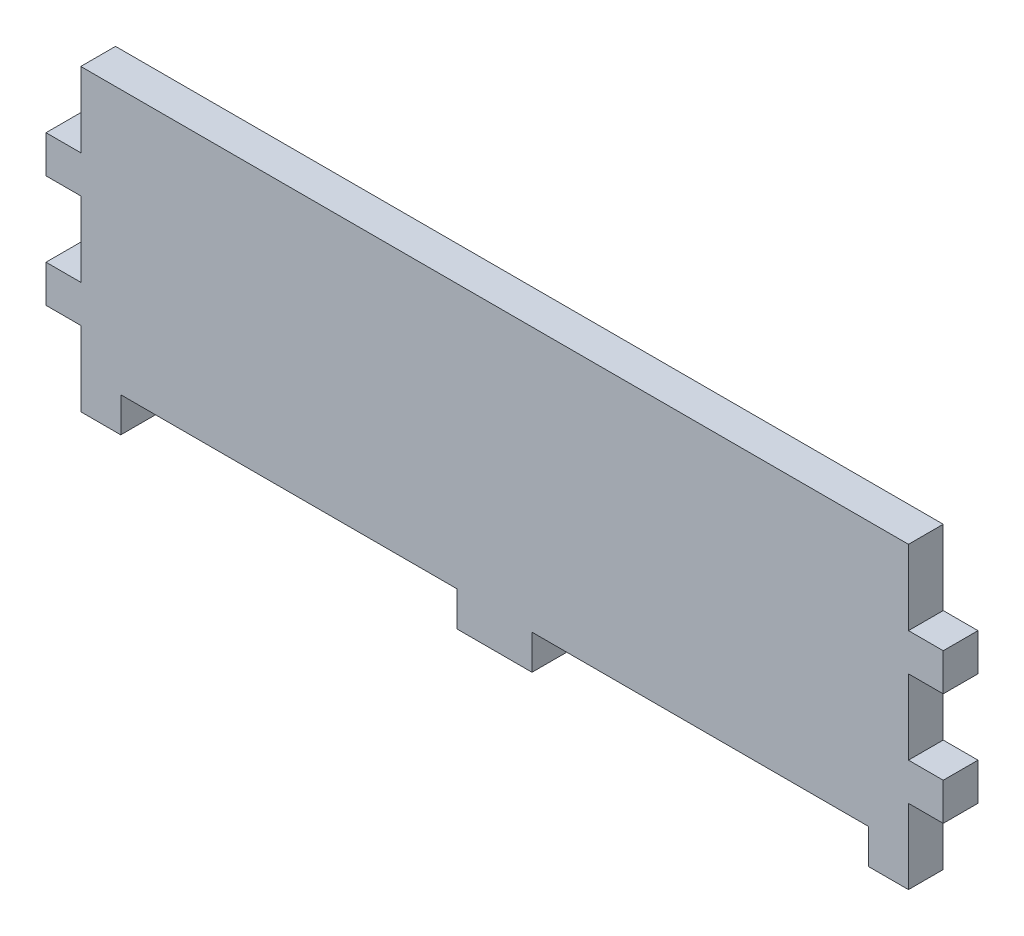
ISO-10303-21;
HEADER;
FILE_DESCRIPTION(('STEP AP214'),'2;1');
FILE_NAME('part.step','',(''),(''),'','','');
FILE_SCHEMA(('AUTOMOTIVE_DESIGN { 1 0 10303 214 1 1 1 1 }'));
ENDSEC;
DATA;
#1=APPLICATION_CONTEXT('core data for automotive mechanical design processes');
#2=APPLICATION_PROTOCOL_DEFINITION('international standard','automotive_design',2000,#1);
#3=PRODUCT_CONTEXT('',#1,'mechanical');
#4=PRODUCT('Part','Part','',(#3));
#5=PRODUCT_RELATED_PRODUCT_CATEGORY('part','',(#4));
#6=PRODUCT_DEFINITION_FORMATION('','',#4);
#7=PRODUCT_DEFINITION_CONTEXT('part definition',#1,'design');
#8=PRODUCT_DEFINITION('design','',#6,#7);
#9=PRODUCT_DEFINITION_SHAPE('','',#8);
#10=(LENGTH_UNIT() NAMED_UNIT(*) SI_UNIT(.MILLI.,.METRE.));
#11=(NAMED_UNIT(*) PLANE_ANGLE_UNIT() SI_UNIT($,.RADIAN.));
#12=(NAMED_UNIT(*) SI_UNIT($,.STERADIAN.) SOLID_ANGLE_UNIT());
#13=UNCERTAINTY_MEASURE_WITH_UNIT(LENGTH_MEASURE(1.E-05),#10,'distance_accuracy_value','');
#14=(GEOMETRIC_REPRESENTATION_CONTEXT(3) GLOBAL_UNCERTAINTY_ASSIGNED_CONTEXT((#13)) GLOBAL_UNIT_ASSIGNED_CONTEXT((#10,
#11,#12)) REPRESENTATION_CONTEXT('',''));
#15=CARTESIAN_POINT('',(0.,0.,0.));
#16=DIRECTION('',(0.,0.,1.));
#17=DIRECTION('',(1.,0.,0.));
#18=AXIS2_PLACEMENT_3D('',#15,#16,#17);
#19=CARTESIAN_POINT('',(-382.738681283592,-50.7278101317852,11.81));
#20=DIRECTION('',(-1.,0.,0.));
#21=DIRECTION('',(0.,-1.,0.));
#22=AXIS2_PLACEMENT_3D('',#19,#20,#21);
#23=PLANE('',#22);
#24=DIRECTION('',(0.,0.,1.));
#25=VECTOR('',#24,1.);
#26=CARTESIAN_POINT('',(-382.738681283592,-114.227810131785,0.));
#27=LINE('',#26,#25);
#28=CARTESIAN_POINT('',(-382.738681283592,-114.227810131785,0.));
#29=VERTEX_POINT('',#28);
#30=CARTESIAN_POINT('',(-382.738681283592,-114.227810131785,11.81));
#31=VERTEX_POINT('',#30);
#32=EDGE_CURVE('E410',#29,#31,#27,.T.);
#33=ORIENTED_EDGE('',*,*,#32,.T.);
#34=DIRECTION('',(0.,1.,0.));
#35=VECTOR('',#34,1.);
#36=CARTESIAN_POINT('',(-382.738681283592,-50.7278101317852,11.81));
#37=LINE('',#36,#35);
#38=CARTESIAN_POINT('',(-382.738681283592,-126.927810131785,11.81));
#39=VERTEX_POINT('',#38);
#40=EDGE_CURVE('E273',#39,#31,#37,.T.);
#41=ORIENTED_EDGE('',*,*,#40,.F.);
#42=DIRECTION('',(0.,0.,1.));
#43=VECTOR('',#42,1.);
#44=CARTESIAN_POINT('',(-382.738681283592,-126.927810131785,0.));
#45=LINE('',#44,#43);
#46=CARTESIAN_POINT('',(-382.738681283592,-126.927810131785,0.));
#47=VERTEX_POINT('',#46);
#48=EDGE_CURVE('E438',#47,#39,#45,.T.);
#49=ORIENTED_EDGE('',*,*,#48,.F.);
#50=DIRECTION('',(0.,1.,0.));
#51=VECTOR('',#50,1.);
#52=CARTESIAN_POINT('',(-382.738681283592,-50.7278101317852,0.));
#53=LINE('',#52,#51);
#54=EDGE_CURVE('E244',#47,#29,#53,.T.);
#55=ORIENTED_EDGE('',*,*,#54,.T.);
#56=EDGE_LOOP('',(#33,#41,#49,#55));
#57=FACE_BOUND('',#56,.T.);
#58=ADVANCED_FACE('F34',(#57),#23,.F.);
#59=DIRECTION('',(0.,0.,1.));
#60=VECTOR('',#59,1.);
#61=CARTESIAN_POINT('',(-382.738681283592,-88.8278101317852,0.));
#62=LINE('',#61,#60);
#63=CARTESIAN_POINT('',(-382.738681283592,-88.8278101317852,0.));
#64=VERTEX_POINT('',#63);
#65=CARTESIAN_POINT('',(-382.738681283592,-88.8278101317852,11.81));
#66=VERTEX_POINT('',#65);
#67=EDGE_CURVE('E222',#64,#66,#62,.T.);
#68=ORIENTED_EDGE('',*,*,#67,.F.);
#69=CARTESIAN_POINT('',(-382.738681283592,-76.1278101317852,0.));
#70=VERTEX_POINT('',#69);
#71=EDGE_CURVE('E235',#64,#70,#53,.T.);
#72=ORIENTED_EDGE('',*,*,#71,.T.);
#73=DIRECTION('',(0.,0.,1.));
#74=VECTOR('',#73,1.);
#75=CARTESIAN_POINT('',(-382.738681283592,-76.1278101317852,0.));
#76=LINE('',#75,#74);
#77=CARTESIAN_POINT('',(-382.738681283592,-76.1278101317852,11.81));
#78=VERTEX_POINT('',#77);
#79=EDGE_CURVE('E491',#70,#78,#76,.T.);
#80=ORIENTED_EDGE('',*,*,#79,.T.);
#81=EDGE_CURVE('E237',#66,#78,#37,.T.);
#82=ORIENTED_EDGE('',*,*,#81,.F.);
#83=EDGE_LOOP('',(#68,#72,#80,#82));
#84=FACE_BOUND('',#83,.T.);
#85=ADVANCED_FACE('F233',(#84),#23,.F.);
#86=CARTESIAN_POINT('',(0.,0.,11.81));
#87=DIRECTION('',(0.,0.,1.));
#88=DIRECTION('',(1.,0.,0.));
#89=AXIS2_PLACEMENT_3D('',#86,#87,#88);
#90=PLANE('',#89);
#91=ORIENTED_EDGE('',*,*,#40,.T.);
#92=DIRECTION('',(-1.,0.,0.));
#93=VECTOR('',#92,1.);
#94=CARTESIAN_POINT('',(-382.738681283592,-114.227810131785,11.81));
#95=LINE('',#94,#93);
#96=CARTESIAN_POINT('',(-394.548681283592,-114.227810131785,11.81));
#97=VERTEX_POINT('',#96);
#98=EDGE_CURVE('E228',#31,#97,#95,.T.);
#99=ORIENTED_EDGE('',*,*,#98,.T.);
#100=DIRECTION('',(0.,1.,0.));
#101=VECTOR('',#100,1.);
#102=CARTESIAN_POINT('',(-394.548681283592,-114.227810131785,11.81));
#103=LINE('',#102,#101);
#104=CARTESIAN_POINT('',(-394.548681283592,-88.8278101317852,11.81));
#105=VERTEX_POINT('',#104);
#106=EDGE_CURVE('E504',#97,#105,#103,.T.);
#107=ORIENTED_EDGE('',*,*,#106,.T.);
#108=DIRECTION('',(1.,0.,0.));
#109=VECTOR('',#108,1.);
#110=CARTESIAN_POINT('',(-382.738681283592,-88.8278101317852,11.81));
#111=LINE('',#110,#109);
#112=EDGE_CURVE('E493',#105,#66,#111,.T.);
#113=ORIENTED_EDGE('',*,*,#112,.T.);
#114=ORIENTED_EDGE('',*,*,#81,.T.);
#115=DIRECTION('',(-1.,0.,0.));
#116=VECTOR('',#115,1.);
#117=CARTESIAN_POINT('',(-382.738681283592,-76.1278101317852,11.81));
#118=LINE('',#117,#116);
#119=CARTESIAN_POINT('',(-394.548681283592,-76.1278101317852,11.81));
#120=VERTEX_POINT('',#119);
#121=EDGE_CURVE('E494',#78,#120,#118,.T.);
#122=ORIENTED_EDGE('',*,*,#121,.T.);
#123=DIRECTION('',(0.,1.,0.));
#124=VECTOR('',#123,1.);
#125=CARTESIAN_POINT('',(-394.548681283592,-76.1278101317852,11.81));
#126=LINE('',#125,#124);
#127=CARTESIAN_POINT('',(-394.548681283592,-50.7278101317852,11.81));
#128=VERTEX_POINT('',#127);
#129=EDGE_CURVE('E496',#120,#128,#126,.T.);
#130=ORIENTED_EDGE('',*,*,#129,.T.);
#131=DIRECTION('',(-1.,0.,0.));
#132=VECTOR('',#131,1.);
#133=CARTESIAN_POINT('',(-687.538681283592,-50.7278101317852,11.81));
#134=LINE('',#133,#132);
#135=CARTESIAN_POINT('',(-675.728681283592,-50.7278101317852,11.81));
#136=VERTEX_POINT('',#135);
#137=EDGE_CURVE('E278',#128,#136,#134,.T.);
#138=ORIENTED_EDGE('',*,*,#137,.T.);
#139=DIRECTION('',(0.,1.,0.));
#140=VECTOR('',#139,1.);
#141=CARTESIAN_POINT('',(-675.728681283592,-76.1278101317852,11.81));
#142=LINE('',#141,#140);
#143=CARTESIAN_POINT('',(-675.728681283592,-76.1278101317852,11.81));
#144=VERTEX_POINT('',#143);
#145=EDGE_CURVE('E467',#144,#136,#142,.T.);
#146=ORIENTED_EDGE('',*,*,#145,.F.);
#147=DIRECTION('',(1.,0.,0.));
#148=VECTOR('',#147,1.);
#149=CARTESIAN_POINT('',(-687.538681283592,-76.1278101317852,11.81));
#150=LINE('',#149,#148);
#151=CARTESIAN_POINT('',(-687.538681283592,-76.1278101317852,11.81));
#152=VERTEX_POINT('',#151);
#153=EDGE_CURVE('E435',#152,#144,#150,.T.);
#154=ORIENTED_EDGE('',*,*,#153,.F.);
#155=DIRECTION('',(0.,-1.,0.));
#156=VECTOR('',#155,1.);
#157=CARTESIAN_POINT('',(-687.538681283592,-50.7278101317852,11.81));
#158=LINE('',#157,#156);
#159=CARTESIAN_POINT('',(-687.538681283592,-88.8278101317852,11.81));
#160=VERTEX_POINT('',#159);
#161=EDGE_CURVE('E282',#152,#160,#158,.T.);
#162=ORIENTED_EDGE('',*,*,#161,.T.);
#163=DIRECTION('',(-1.,0.,0.));
#164=VECTOR('',#163,1.);
#165=CARTESIAN_POINT('',(-687.538681283592,-88.8278101317852,11.81));
#166=LINE('',#165,#164);
#167=CARTESIAN_POINT('',(-675.728681283592,-88.8278101317852,11.81));
#168=VERTEX_POINT('',#167);
#169=EDGE_CURVE('E444',#168,#160,#166,.T.);
#170=ORIENTED_EDGE('',*,*,#169,.F.);
#171=DIRECTION('',(0.,1.,0.));
#172=VECTOR('',#171,1.);
#173=CARTESIAN_POINT('',(-675.728681283592,-114.227810131785,11.81));
#174=LINE('',#173,#172);
#175=CARTESIAN_POINT('',(-675.728681283592,-114.227810131785,11.81));
#176=VERTEX_POINT('',#175);
#177=EDGE_CURVE('E454',#176,#168,#174,.T.);
#178=ORIENTED_EDGE('',*,*,#177,.F.);
#179=DIRECTION('',(1.,0.,0.));
#180=VECTOR('',#179,1.);
#181=CARTESIAN_POINT('',(-687.538681283592,-114.227810131785,11.81));
#182=LINE('',#181,#180);
#183=CARTESIAN_POINT('',(-687.538681283592,-114.227810131785,11.81));
#184=VERTEX_POINT('',#183);
#185=EDGE_CURVE('E451',#184,#176,#182,.T.);
#186=ORIENTED_EDGE('',*,*,#185,.F.);
#187=CARTESIAN_POINT('',(-687.538681283592,-126.927810131785,11.81));
#188=VERTEX_POINT('',#187);
#189=EDGE_CURVE('E281',#184,#188,#158,.T.);
#190=ORIENTED_EDGE('',*,*,#189,.T.);
#191=DIRECTION('',(-1.,0.,0.));
#192=VECTOR('',#191,1.);
#193=CARTESIAN_POINT('',(-687.538681283592,-126.927810131785,11.81));
#194=LINE('',#193,#192);
#195=CARTESIAN_POINT('',(-675.728681283592,-126.927810131785,11.81));
#196=VERTEX_POINT('',#195);
#197=EDGE_CURVE('E350',#196,#188,#194,.T.);
#198=ORIENTED_EDGE('',*,*,#197,.F.);
#199=DIRECTION('',(0.,1.,0.));
#200=VECTOR('',#199,1.);
#201=CARTESIAN_POINT('',(-675.728681283592,-152.327810131785,11.81));
#202=LINE('',#201,#200);
#203=CARTESIAN_POINT('',(-675.728681283592,-152.327810131785,11.81));
#204=VERTEX_POINT('',#203);
#205=EDGE_CURVE('E340',#204,#196,#202,.T.);
#206=ORIENTED_EDGE('',*,*,#205,.F.);
#207=DIRECTION('',(1.,0.,0.));
#208=VECTOR('',#207,1.);
#209=CARTESIAN_POINT('',(-687.538681283592,-152.327810131785,11.81));
#210=LINE('',#209,#208);
#211=CARTESIAN_POINT('',(-662.138681283592,-152.327810131785,11.81));
#212=VERTEX_POINT('',#211);
#213=EDGE_CURVE('E359',#204,#212,#210,.T.);
#214=ORIENTED_EDGE('',*,*,#213,.T.);
#215=DIRECTION('',(0.,1.,0.));
#216=VECTOR('',#215,1.);
#217=CARTESIAN_POINT('',(-662.138681283592,-152.327810131785,11.81));
#218=LINE('',#217,#216);
#219=CARTESIAN_POINT('',(-662.138681283592,-140.517810131785,11.81));
#220=VERTEX_POINT('',#219);
#221=EDGE_CURVE('E366',#212,#220,#218,.T.);
#222=ORIENTED_EDGE('',*,*,#221,.T.);
#223=DIRECTION('',(1.,0.,0.));
#224=VECTOR('',#223,1.);
#225=CARTESIAN_POINT('',(-687.538681283592,-140.517810131785,11.81));
#226=LINE('',#225,#224);
#227=CARTESIAN_POINT('',(-547.838681283592,-140.517810131785,11.81));
#228=VERTEX_POINT('',#227);
#229=EDGE_CURVE('E11',#220,#228,#226,.T.);
#230=ORIENTED_EDGE('',*,*,#229,.T.);
#231=DIRECTION('',(0.,-1.,0.));
#232=VECTOR('',#231,1.);
#233=CARTESIAN_POINT('',(-547.838681283592,-152.327810131785,11.81));
#234=LINE('',#233,#232);
#235=CARTESIAN_POINT('',(-547.838681283592,-152.327810131785,11.81));
#236=VERTEX_POINT('',#235);
#237=EDGE_CURVE('E321',#228,#236,#234,.T.);
#238=ORIENTED_EDGE('',*,*,#237,.T.);
#239=DIRECTION('',(1.,0.,0.));
#240=VECTOR('',#239,1.);
#241=CARTESIAN_POINT('',(-547.838681283592,-152.327810131785,11.81));
#242=LINE('',#241,#240);
#243=CARTESIAN_POINT('',(-522.438681283592,-152.327810131785,11.81));
#244=VERTEX_POINT('',#243);
#245=EDGE_CURVE('E335',#236,#244,#242,.T.);
#246=ORIENTED_EDGE('',*,*,#245,.T.);
#247=DIRECTION('',(0.,1.,0.));
#248=VECTOR('',#247,1.);
#249=CARTESIAN_POINT('',(-522.438681283592,-152.327810131785,11.81));
#250=LINE('',#249,#248);
#251=CARTESIAN_POINT('',(-522.438681283592,-140.517810131785,11.81));
#252=VERTEX_POINT('',#251);
#253=EDGE_CURVE('E300',#244,#252,#250,.T.);
#254=ORIENTED_EDGE('',*,*,#253,.T.);
#255=CARTESIAN_POINT('',(-408.138681283592,-140.517810131785,11.81));
#256=VERTEX_POINT('',#255);
#257=EDGE_CURVE('E42',#252,#256,#226,.T.);
#258=ORIENTED_EDGE('',*,*,#257,.T.);
#259=DIRECTION('',(0.,-1.,0.));
#260=VECTOR('',#259,1.);
#261=CARTESIAN_POINT('',(-408.138681283592,-152.327810131785,11.81));
#262=LINE('',#261,#260);
#263=CARTESIAN_POINT('',(-408.138681283592,-152.327810131785,11.81));
#264=VERTEX_POINT('',#263);
#265=EDGE_CURVE('E297',#256,#264,#262,.T.);
#266=ORIENTED_EDGE('',*,*,#265,.T.);
#267=DIRECTION('',(1.,0.,0.));
#268=VECTOR('',#267,1.);
#269=CARTESIAN_POINT('',(-408.138681283592,-152.327810131785,11.81));
#270=LINE('',#269,#268);
#271=CARTESIAN_POINT('',(-394.548681283592,-152.327810131785,11.81));
#272=VERTEX_POINT('',#271);
#273=EDGE_CURVE('E309',#264,#272,#270,.T.);
#274=ORIENTED_EDGE('',*,*,#273,.T.);
#275=DIRECTION('',(0.,1.,0.));
#276=VECTOR('',#275,1.);
#277=CARTESIAN_POINT('',(-394.548681283592,-152.327810131785,11.81));
#278=LINE('',#277,#276);
#279=CARTESIAN_POINT('',(-394.548681283592,-126.927810131785,11.81));
#280=VERTEX_POINT('',#279);
#281=EDGE_CURVE('E422',#272,#280,#278,.T.);
#282=ORIENTED_EDGE('',*,*,#281,.T.);
#283=DIRECTION('',(1.,0.,0.));
#284=VECTOR('',#283,1.);
#285=CARTESIAN_POINT('',(-382.738681283592,-126.927810131785,11.81));
#286=LINE('',#285,#284);
#287=EDGE_CURVE('E414',#280,#39,#286,.T.);
#288=ORIENTED_EDGE('',*,*,#287,.T.);
#289=EDGE_LOOP('',(#91,#99,#107,#113,#114,#122,#130,#138,#146,#154,#162,#170,#178,#186,#190,
#198,#206,#214,#222,#230,#238,#246,#254,#258,#266,#274,#282,#288));
#290=FACE_BOUND('',#289,.T.);
#291=ADVANCED_FACE('F295',(#290),#90,.T.);
#292=CARTESIAN_POINT('',(0.,0.,0.));
#293=DIRECTION('',(0.,0.,1.));
#294=DIRECTION('',(1.,0.,0.));
#295=AXIS2_PLACEMENT_3D('',#292,#293,#294);
#296=PLANE('',#295);
#297=DIRECTION('',(-1.,0.,0.));
#298=VECTOR('',#297,1.);
#299=CARTESIAN_POINT('',(-382.738681283592,-114.227810131785,0.));
#300=LINE('',#299,#298);
#301=CARTESIAN_POINT('',(-394.548681283592,-114.227810131785,0.));
#302=VERTEX_POINT('',#301);
#303=EDGE_CURVE('E238',#29,#302,#300,.T.);
#304=ORIENTED_EDGE('',*,*,#303,.F.);
#305=ORIENTED_EDGE('',*,*,#54,.F.);
#306=DIRECTION('',(1.,0.,0.));
#307=VECTOR('',#306,1.);
#308=CARTESIAN_POINT('',(-382.738681283592,-126.927810131785,0.));
#309=LINE('',#308,#307);
#310=CARTESIAN_POINT('',(-394.548681283592,-126.927810131785,0.));
#311=VERTEX_POINT('',#310);
#312=EDGE_CURVE('E426',#311,#47,#309,.T.);
#313=ORIENTED_EDGE('',*,*,#312,.F.);
#314=DIRECTION('',(0.,1.,0.));
#315=VECTOR('',#314,1.);
#316=CARTESIAN_POINT('',(-394.548681283592,-152.327810131785,0.));
#317=LINE('',#316,#315);
#318=CARTESIAN_POINT('',(-394.548681283592,-152.327810131785,0.));
#319=VERTEX_POINT('',#318);
#320=EDGE_CURVE('E429',#319,#311,#317,.T.);
#321=ORIENTED_EDGE('',*,*,#320,.F.);
#322=DIRECTION('',(1.,0.,0.));
#323=VECTOR('',#322,1.);
#324=CARTESIAN_POINT('',(-408.138681283592,-152.327810131785,0.));
#325=LINE('',#324,#323);
#326=CARTESIAN_POINT('',(-408.138681283592,-152.327810131785,0.));
#327=VERTEX_POINT('',#326);
#328=EDGE_CURVE('E317',#327,#319,#325,.T.);
#329=ORIENTED_EDGE('',*,*,#328,.F.);
#330=DIRECTION('',(0.,-1.,0.));
#331=VECTOR('',#330,1.);
#332=CARTESIAN_POINT('',(-408.138681283592,-152.327810131785,0.));
#333=LINE('',#332,#331);
#334=CARTESIAN_POINT('',(-408.138681283592,-140.517810131785,0.));
#335=VERTEX_POINT('',#334);
#336=EDGE_CURVE('E312',#335,#327,#333,.T.);
#337=ORIENTED_EDGE('',*,*,#336,.F.);
#338=DIRECTION('',(1.,0.,0.));
#339=VECTOR('',#338,1.);
#340=CARTESIAN_POINT('',(-687.538681283592,-140.517810131785,0.));
#341=LINE('',#340,#339);
#342=CARTESIAN_POINT('',(-522.438681283592,-140.517810131785,0.));
#343=VERTEX_POINT('',#342);
#344=EDGE_CURVE('E262',#343,#335,#341,.T.);
#345=ORIENTED_EDGE('',*,*,#344,.F.);
#346=DIRECTION('',(0.,1.,0.));
#347=VECTOR('',#346,1.);
#348=CARTESIAN_POINT('',(-522.438681283592,-152.327810131785,0.));
#349=LINE('',#348,#347);
#350=CARTESIAN_POINT('',(-522.438681283592,-152.327810131785,0.));
#351=VERTEX_POINT('',#350);
#352=EDGE_CURVE('E329',#351,#343,#349,.T.);
#353=ORIENTED_EDGE('',*,*,#352,.F.);
#354=DIRECTION('',(1.,0.,0.));
#355=VECTOR('',#354,1.);
#356=CARTESIAN_POINT('',(-547.838681283592,-152.327810131785,0.));
#357=LINE('',#356,#355);
#358=CARTESIAN_POINT('',(-547.838681283592,-152.327810131785,0.));
#359=VERTEX_POINT('',#358);
#360=EDGE_CURVE('E326',#359,#351,#357,.T.);
#361=ORIENTED_EDGE('',*,*,#360,.F.);
#362=DIRECTION('',(0.,-1.,0.));
#363=VECTOR('',#362,1.);
#364=CARTESIAN_POINT('',(-547.838681283592,-152.327810131785,0.));
#365=LINE('',#364,#363);
#366=CARTESIAN_POINT('',(-547.838681283592,-140.517810131785,0.));
#367=VERTEX_POINT('',#366);
#368=EDGE_CURVE('E323',#367,#359,#365,.T.);
#369=ORIENTED_EDGE('',*,*,#368,.F.);
#370=CARTESIAN_POINT('',(-662.138681283592,-140.517810131785,0.));
#371=VERTEX_POINT('',#370);
#372=EDGE_CURVE('E37',#371,#367,#341,.T.);
#373=ORIENTED_EDGE('',*,*,#372,.F.);
#374=DIRECTION('',(0.,1.,0.));
#375=VECTOR('',#374,1.);
#376=CARTESIAN_POINT('',(-662.138681283592,-152.327810131785,0.));
#377=LINE('',#376,#375);
#378=CARTESIAN_POINT('',(-662.138681283592,-152.327810131785,0.));
#379=VERTEX_POINT('',#378);
#380=EDGE_CURVE('E365',#379,#371,#377,.T.);
#381=ORIENTED_EDGE('',*,*,#380,.F.);
#382=DIRECTION('',(1.,0.,0.));
#383=VECTOR('',#382,1.);
#384=CARTESIAN_POINT('',(-687.538681283592,-152.327810131785,0.));
#385=LINE('',#384,#383);
#386=CARTESIAN_POINT('',(-675.728681283592,-152.327810131785,0.));
#387=VERTEX_POINT('',#386);
#388=EDGE_CURVE('E363',#387,#379,#385,.T.);
#389=ORIENTED_EDGE('',*,*,#388,.F.);
#390=DIRECTION('',(0.,1.,0.));
#391=VECTOR('',#390,1.);
#392=CARTESIAN_POINT('',(-675.728681283592,-152.327810131785,0.));
#393=LINE('',#392,#391);
#394=CARTESIAN_POINT('',(-675.728681283592,-126.927810131785,0.));
#395=VERTEX_POINT('',#394);
#396=EDGE_CURVE('E346',#387,#395,#393,.T.);
#397=ORIENTED_EDGE('',*,*,#396,.T.);
#398=DIRECTION('',(-1.,0.,0.));
#399=VECTOR('',#398,1.);
#400=CARTESIAN_POINT('',(-687.538681283592,-126.927810131785,0.));
#401=LINE('',#400,#399);
#402=CARTESIAN_POINT('',(-687.538681283592,-126.927810131785,0.));
#403=VERTEX_POINT('',#402);
#404=EDGE_CURVE('E349',#395,#403,#401,.T.);
#405=ORIENTED_EDGE('',*,*,#404,.T.);
#406=DIRECTION('',(0.,-1.,0.));
#407=VECTOR('',#406,1.);
#408=CARTESIAN_POINT('',(-687.538681283592,-50.7278101317852,0.));
#409=LINE('',#408,#407);
#410=CARTESIAN_POINT('',(-687.538681283592,-114.227810131785,0.));
#411=VERTEX_POINT('',#410);
#412=EDGE_CURVE('E254',#411,#403,#409,.T.);
#413=ORIENTED_EDGE('',*,*,#412,.F.);
#414=DIRECTION('',(1.,0.,0.));
#415=VECTOR('',#414,1.);
#416=CARTESIAN_POINT('',(-687.538681283592,-114.227810131785,0.));
#417=LINE('',#416,#415);
#418=CARTESIAN_POINT('',(-675.728681283592,-114.227810131785,0.));
#419=VERTEX_POINT('',#418);
#420=EDGE_CURVE('E440',#411,#419,#417,.T.);
#421=ORIENTED_EDGE('',*,*,#420,.T.);
#422=DIRECTION('',(0.,1.,0.));
#423=VECTOR('',#422,1.);
#424=CARTESIAN_POINT('',(-675.728681283592,-114.227810131785,0.));
#425=LINE('',#424,#423);
#426=CARTESIAN_POINT('',(-675.728681283592,-88.8278101317852,0.));
#427=VERTEX_POINT('',#426);
#428=EDGE_CURVE('E443',#419,#427,#425,.T.);
#429=ORIENTED_EDGE('',*,*,#428,.T.);
#430=DIRECTION('',(-1.,0.,0.));
#431=VECTOR('',#430,1.);
#432=CARTESIAN_POINT('',(-687.538681283592,-88.8278101317852,0.));
#433=LINE('',#432,#431);
#434=CARTESIAN_POINT('',(-687.538681283592,-88.8278101317852,0.));
#435=VERTEX_POINT('',#434);
#436=EDGE_CURVE('E447',#427,#435,#433,.T.);
#437=ORIENTED_EDGE('',*,*,#436,.T.);
#438=CARTESIAN_POINT('',(-687.538681283592,-76.1278101317852,0.));
#439=VERTEX_POINT('',#438);
#440=EDGE_CURVE('E255',#439,#435,#409,.T.);
#441=ORIENTED_EDGE('',*,*,#440,.F.);
#442=DIRECTION('',(1.,0.,0.));
#443=VECTOR('',#442,1.);
#444=CARTESIAN_POINT('',(-687.538681283592,-76.1278101317852,0.));
#445=LINE('',#444,#443);
#446=CARTESIAN_POINT('',(-675.728681283592,-76.1278101317852,0.));
#447=VERTEX_POINT('',#446);
#448=EDGE_CURVE('E463',#439,#447,#445,.T.);
#449=ORIENTED_EDGE('',*,*,#448,.T.);
#450=DIRECTION('',(0.,1.,0.));
#451=VECTOR('',#450,1.);
#452=CARTESIAN_POINT('',(-675.728681283592,-76.1278101317852,0.));
#453=LINE('',#452,#451);
#454=CARTESIAN_POINT('',(-675.728681283592,-50.7278101317852,0.));
#455=VERTEX_POINT('',#454);
#456=EDGE_CURVE('E466',#447,#455,#453,.T.);
#457=ORIENTED_EDGE('',*,*,#456,.T.);
#458=DIRECTION('',(-1.,0.,0.));
#459=VECTOR('',#458,1.);
#460=CARTESIAN_POINT('',(-687.538681283592,-50.7278101317852,0.));
#461=LINE('',#460,#459);
#462=CARTESIAN_POINT('',(-394.548681283593,-50.7278101317852,0.));
#463=VERTEX_POINT('',#462);
#464=EDGE_CURVE('E248',#463,#455,#461,.T.);
#465=ORIENTED_EDGE('',*,*,#464,.F.);
#466=DIRECTION('',(0.,1.,0.));
#467=VECTOR('',#466,1.);
#468=CARTESIAN_POINT('',(-394.548681283592,-76.1278101317852,0.));
#469=LINE('',#468,#467);
#470=CARTESIAN_POINT('',(-394.548681283592,-76.1278101317852,0.));
#471=VERTEX_POINT('',#470);
#472=EDGE_CURVE('E58',#471,#463,#469,.T.);
#473=ORIENTED_EDGE('',*,*,#472,.F.);
#474=DIRECTION('',(-1.,0.,0.));
#475=VECTOR('',#474,1.);
#476=CARTESIAN_POINT('',(-382.738681283592,-76.1278101317852,0.));
#477=LINE('',#476,#475);
#478=EDGE_CURVE('E243',#70,#471,#477,.T.);
#479=ORIENTED_EDGE('',*,*,#478,.F.);
#480=ORIENTED_EDGE('',*,*,#71,.F.);
#481=DIRECTION('',(1.,0.,0.));
#482=VECTOR('',#481,1.);
#483=CARTESIAN_POINT('',(-382.738681283592,-88.8278101317852,0.));
#484=LINE('',#483,#482);
#485=CARTESIAN_POINT('',(-394.548681283592,-88.8278101317852,0.));
#486=VERTEX_POINT('',#485);
#487=EDGE_CURVE('E219',#486,#64,#484,.T.);
#488=ORIENTED_EDGE('',*,*,#487,.F.);
#489=DIRECTION('',(0.,1.,0.));
#490=VECTOR('',#489,1.);
#491=CARTESIAN_POINT('',(-394.548681283592,-114.227810131785,0.));
#492=LINE('',#491,#490);
#493=EDGE_CURVE('E227',#302,#486,#492,.T.);
#494=ORIENTED_EDGE('',*,*,#493,.F.);
#495=EDGE_LOOP('',(#304,#305,#313,#321,#329,#337,#345,#353,#361,#369,#373,#381,#389,#397,#405,
#413,#421,#429,#437,#441,#449,#457,#465,#473,#479,#480,#488,#494));
#496=FACE_BOUND('',#495,.T.);
#497=ADVANCED_FACE('F242',(#496),#296,.F.);
#498=CARTESIAN_POINT('',(-687.538681283592,-50.7278101317852,11.81));
#499=DIRECTION('',(0.,-1.,0.));
#500=DIRECTION('',(1.,0.,0.));
#501=AXIS2_PLACEMENT_3D('',#498,#499,#500);
#502=PLANE('',#501);
#503=DIRECTION('',(0.,0.,1.));
#504=VECTOR('',#503,1.);
#505=CARTESIAN_POINT('',(-394.548681283592,-50.7278101317852,0.));
#506=LINE('',#505,#504);
#507=EDGE_CURVE('E487',#463,#128,#506,.T.);
#508=ORIENTED_EDGE('',*,*,#507,.F.);
#509=ORIENTED_EDGE('',*,*,#464,.T.);
#510=DIRECTION('',(0.,0.,1.));
#511=VECTOR('',#510,1.);
#512=CARTESIAN_POINT('',(-675.728681283592,-50.7278101317852,0.));
#513=LINE('',#512,#511);
#514=EDGE_CURVE('E455',#455,#136,#513,.T.);
#515=ORIENTED_EDGE('',*,*,#514,.T.);
#516=ORIENTED_EDGE('',*,*,#137,.F.);
#517=EDGE_LOOP('',(#508,#509,#515,#516));
#518=FACE_BOUND('',#517,.T.);
#519=ADVANCED_FACE('F557',(#518),#502,.F.);
#520=CARTESIAN_POINT('',(-408.138681283592,-152.327810131785,0.));
#521=DIRECTION('',(0.,-1.,0.));
#522=DIRECTION('',(0.,0.,-1.));
#523=AXIS2_PLACEMENT_3D('',#520,#521,#522);
#524=PLANE('',#523);
#525=ORIENTED_EDGE('',*,*,#328,.T.);
#526=DIRECTION('',(0.,0.,1.));
#527=VECTOR('',#526,1.);
#528=CARTESIAN_POINT('',(-394.548681283592,-152.327810131785,0.));
#529=LINE('',#528,#527);
#530=EDGE_CURVE('E432',#319,#272,#529,.T.);
#531=ORIENTED_EDGE('',*,*,#530,.T.);
#532=ORIENTED_EDGE('',*,*,#273,.F.);
#533=DIRECTION('',(0.,0.,1.));
#534=VECTOR('',#533,1.);
#535=CARTESIAN_POINT('',(-408.138681283592,-152.327810131785,0.));
#536=LINE('',#535,#534);
#537=EDGE_CURVE('E307',#327,#264,#536,.T.);
#538=ORIENTED_EDGE('',*,*,#537,.F.);
#539=EDGE_LOOP('',(#525,#531,#532,#538));
#540=FACE_BOUND('',#539,.T.);
#541=ADVANCED_FACE('F482',(#540),#524,.T.);
#542=CARTESIAN_POINT('',(-687.538681283592,-50.7278101317852,11.81));
#543=DIRECTION('',(1.,0.,0.));
#544=DIRECTION('',(0.,0.,-1.));
#545=AXIS2_PLACEMENT_3D('',#542,#543,#544);
#546=PLANE('',#545);
#547=ORIENTED_EDGE('',*,*,#440,.T.);
#548=DIRECTION('',(0.,0.,1.));
#549=VECTOR('',#548,1.);
#550=CARTESIAN_POINT('',(-687.538681283592,-88.8278101317852,0.));
#551=LINE('',#550,#549);
#552=EDGE_CURVE('E310',#435,#160,#551,.T.);
#553=ORIENTED_EDGE('',*,*,#552,.T.);
#554=ORIENTED_EDGE('',*,*,#161,.F.);
#555=DIRECTION('',(0.,0.,1.));
#556=VECTOR('',#555,1.);
#557=CARTESIAN_POINT('',(-687.538681283592,-76.1278101317852,0.));
#558=LINE('',#557,#556);
#559=EDGE_CURVE('E470',#439,#152,#558,.T.);
#560=ORIENTED_EDGE('',*,*,#559,.F.);
#561=EDGE_LOOP('',(#547,#553,#554,#560));
#562=FACE_BOUND('',#561,.T.);
#563=ADVANCED_FACE('F401',(#562),#546,.F.);
#564=CARTESIAN_POINT('',(-687.538681283592,-140.517810131785,11.81));
#565=DIRECTION('',(0.,1.,0.));
#566=DIRECTION('',(-1.,0.,0.));
#567=AXIS2_PLACEMENT_3D('',#564,#565,#566);
#568=PLANE('',#567);
#569=ORIENTED_EDGE('',*,*,#372,.T.);
#570=DIRECTION('',(0.,0.,1.));
#571=VECTOR('',#570,1.);
#572=CARTESIAN_POINT('',(-547.838681283592,-140.517810131785,0.));
#573=LINE('',#572,#571);
#574=EDGE_CURVE('E338',#367,#228,#573,.T.);
#575=ORIENTED_EDGE('',*,*,#574,.T.);
#576=ORIENTED_EDGE('',*,*,#229,.F.);
#577=DIRECTION('',(0.,0.,1.));
#578=VECTOR('',#577,1.);
#579=CARTESIAN_POINT('',(-662.138681283592,-140.517810131785,0.));
#580=LINE('',#579,#578);
#581=EDGE_CURVE('E245',#371,#220,#580,.T.);
#582=ORIENTED_EDGE('',*,*,#581,.F.);
#583=EDGE_LOOP('',(#569,#575,#576,#582));
#584=FACE_BOUND('',#583,.T.);
#585=ADVANCED_FACE('F380',(#584),#568,.F.);
#586=ORIENTED_EDGE('',*,*,#344,.T.);
#587=DIRECTION('',(0.,0.,1.));
#588=VECTOR('',#587,1.);
#589=CARTESIAN_POINT('',(-408.138681283592,-140.517810131785,0.));
#590=LINE('',#589,#588);
#591=EDGE_CURVE('E305',#335,#256,#590,.T.);
#592=ORIENTED_EDGE('',*,*,#591,.T.);
#593=ORIENTED_EDGE('',*,*,#257,.F.);
#594=DIRECTION('',(0.,0.,1.));
#595=VECTOR('',#594,1.);
#596=CARTESIAN_POINT('',(-522.438681283592,-140.517810131785,0.));
#597=LINE('',#596,#595);
#598=EDGE_CURVE('E341',#343,#252,#597,.T.);
#599=ORIENTED_EDGE('',*,*,#598,.F.);
#600=EDGE_LOOP('',(#586,#592,#593,#599));
#601=FACE_BOUND('',#600,.T.);
#602=ADVANCED_FACE('F392',(#601),#568,.F.);
#603=ORIENTED_EDGE('',*,*,#189,.F.);
#604=DIRECTION('',(0.,0.,1.));
#605=VECTOR('',#604,1.);
#606=CARTESIAN_POINT('',(-687.538681283592,-114.227810131785,0.));
#607=LINE('',#606,#605);
#608=EDGE_CURVE('E450',#411,#184,#607,.T.);
#609=ORIENTED_EDGE('',*,*,#608,.F.);
#610=ORIENTED_EDGE('',*,*,#412,.T.);
#611=DIRECTION('',(0.,0.,1.));
#612=VECTOR('',#611,1.);
#613=CARTESIAN_POINT('',(-687.538681283592,-126.927810131785,0.));
#614=LINE('',#613,#612);
#615=EDGE_CURVE('E357',#403,#188,#614,.T.);
#616=ORIENTED_EDGE('',*,*,#615,.T.);
#617=EDGE_LOOP('',(#603,#609,#610,#616));
#618=FACE_BOUND('',#617,.T.);
#619=ADVANCED_FACE('F394',(#618),#546,.F.);
#620=CARTESIAN_POINT('',(-662.138681283592,-152.327810131785,0.));
#621=DIRECTION('',(1.,0.,0.));
#622=DIRECTION('',(0.,0.,-1.));
#623=AXIS2_PLACEMENT_3D('',#620,#621,#622);
#624=PLANE('',#623);
#625=ORIENTED_EDGE('',*,*,#221,.F.);
#626=DIRECTION('',(0.,0.,1.));
#627=VECTOR('',#626,1.);
#628=CARTESIAN_POINT('',(-662.138681283592,-152.327810131785,0.));
#629=LINE('',#628,#627);
#630=EDGE_CURVE('E250',#379,#212,#629,.T.);
#631=ORIENTED_EDGE('',*,*,#630,.F.);
#632=ORIENTED_EDGE('',*,*,#380,.T.);
#633=ORIENTED_EDGE('',*,*,#581,.T.);
#634=EDGE_LOOP('',(#625,#631,#632,#633));
#635=FACE_BOUND('',#634,.T.);
#636=ADVANCED_FACE('F378',(#635),#624,.T.);
#637=CARTESIAN_POINT('',(-687.538681283592,-152.327810131785,0.));
#638=DIRECTION('',(0.,-1.,0.));
#639=DIRECTION('',(0.,0.,-1.));
#640=AXIS2_PLACEMENT_3D('',#637,#638,#639);
#641=PLANE('',#640);
#642=DIRECTION('',(0.,0.,1.));
#643=VECTOR('',#642,1.);
#644=CARTESIAN_POINT('',(-675.728681283592,-152.327810131785,0.));
#645=LINE('',#644,#643);
#646=EDGE_CURVE('E353',#387,#204,#645,.T.);
#647=ORIENTED_EDGE('',*,*,#646,.F.);
#648=ORIENTED_EDGE('',*,*,#388,.T.);
#649=ORIENTED_EDGE('',*,*,#630,.T.);
#650=ORIENTED_EDGE('',*,*,#213,.F.);
#651=EDGE_LOOP('',(#647,#648,#649,#650));
#652=FACE_BOUND('',#651,.T.);
#653=ADVANCED_FACE('F570',(#652),#641,.T.);
#654=CARTESIAN_POINT('',(-687.538681283592,-126.927810131785,0.));
#655=DIRECTION('',(0.,1.,0.));
#656=DIRECTION('',(0.,0.,1.));
#657=AXIS2_PLACEMENT_3D('',#654,#655,#656);
#658=PLANE('',#657);
#659=ORIENTED_EDGE('',*,*,#197,.T.);
#660=ORIENTED_EDGE('',*,*,#615,.F.);
#661=ORIENTED_EDGE('',*,*,#404,.F.);
#662=DIRECTION('',(0.,0.,1.));
#663=VECTOR('',#662,1.);
#664=CARTESIAN_POINT('',(-675.728681283592,-126.927810131785,0.));
#665=LINE('',#664,#663);
#666=EDGE_CURVE('E360',#395,#196,#665,.T.);
#667=ORIENTED_EDGE('',*,*,#666,.T.);
#668=EDGE_LOOP('',(#659,#660,#661,#667));
#669=FACE_BOUND('',#668,.T.);
#670=ADVANCED_FACE('F567',(#669),#658,.F.);
#671=CARTESIAN_POINT('',(-675.728681283592,-152.327810131785,0.));
#672=DIRECTION('',(1.,0.,0.));
#673=DIRECTION('',(0.,1.,0.));
#674=AXIS2_PLACEMENT_3D('',#671,#672,#673);
#675=PLANE('',#674);
#676=ORIENTED_EDGE('',*,*,#205,.T.);
#677=ORIENTED_EDGE('',*,*,#666,.F.);
#678=ORIENTED_EDGE('',*,*,#396,.F.);
#679=ORIENTED_EDGE('',*,*,#646,.T.);
#680=EDGE_LOOP('',(#676,#677,#678,#679));
#681=FACE_BOUND('',#680,.T.);
#682=ADVANCED_FACE('F566',(#681),#675,.F.);
#683=CARTESIAN_POINT('',(-547.838681283592,-152.327810131785,0.));
#684=DIRECTION('',(-1.,0.,0.));
#685=DIRECTION('',(0.,0.,1.));
#686=AXIS2_PLACEMENT_3D('',#683,#684,#685);
#687=PLANE('',#686);
#688=ORIENTED_EDGE('',*,*,#237,.F.);
#689=ORIENTED_EDGE('',*,*,#574,.F.);
#690=ORIENTED_EDGE('',*,*,#368,.T.);
#691=DIRECTION('',(0.,0.,1.));
#692=VECTOR('',#691,1.);
#693=CARTESIAN_POINT('',(-547.838681283592,-152.327810131785,0.));
#694=LINE('',#693,#692);
#695=EDGE_CURVE('E332',#359,#236,#694,.T.);
#696=ORIENTED_EDGE('',*,*,#695,.T.);
#697=EDGE_LOOP('',(#688,#689,#690,#696));
#698=FACE_BOUND('',#697,.T.);
#699=ADVANCED_FACE('F386',(#698),#687,.T.);
#700=CARTESIAN_POINT('',(-522.438681283592,-152.327810131785,0.));
#701=DIRECTION('',(1.,0.,0.));
#702=DIRECTION('',(0.,0.,-1.));
#703=AXIS2_PLACEMENT_3D('',#700,#701,#702);
#704=PLANE('',#703);
#705=ORIENTED_EDGE('',*,*,#253,.F.);
#706=DIRECTION('',(0.,0.,1.));
#707=VECTOR('',#706,1.);
#708=CARTESIAN_POINT('',(-522.438681283592,-152.327810131785,0.));
#709=LINE('',#708,#707);
#710=EDGE_CURVE('E343',#351,#244,#709,.T.);
#711=ORIENTED_EDGE('',*,*,#710,.F.);
#712=ORIENTED_EDGE('',*,*,#352,.T.);
#713=ORIENTED_EDGE('',*,*,#598,.T.);
#714=EDGE_LOOP('',(#705,#711,#712,#713));
#715=FACE_BOUND('',#714,.T.);
#716=ADVANCED_FACE('F391',(#715),#704,.T.);
#717=CARTESIAN_POINT('',(-547.838681283592,-152.327810131785,0.));
#718=DIRECTION('',(0.,-1.,0.));
#719=DIRECTION('',(0.,0.,-1.));
#720=AXIS2_PLACEMENT_3D('',#717,#718,#719);
#721=PLANE('',#720);
#722=ORIENTED_EDGE('',*,*,#245,.F.);
#723=ORIENTED_EDGE('',*,*,#695,.F.);
#724=ORIENTED_EDGE('',*,*,#360,.T.);
#725=ORIENTED_EDGE('',*,*,#710,.T.);
#726=EDGE_LOOP('',(#722,#723,#724,#725));
#727=FACE_BOUND('',#726,.T.);
#728=ADVANCED_FACE('F389',(#727),#721,.T.);
#729=CARTESIAN_POINT('',(-408.138681283592,-152.327810131785,0.));
#730=DIRECTION('',(-1.,0.,0.));
#731=DIRECTION('',(0.,0.,1.));
#732=AXIS2_PLACEMENT_3D('',#729,#730,#731);
#733=PLANE('',#732);
#734=ORIENTED_EDGE('',*,*,#265,.F.);
#735=ORIENTED_EDGE('',*,*,#591,.F.);
#736=ORIENTED_EDGE('',*,*,#336,.T.);
#737=ORIENTED_EDGE('',*,*,#537,.T.);
#738=EDGE_LOOP('',(#734,#735,#736,#737));
#739=FACE_BOUND('',#738,.T.);
#740=ADVANCED_FACE('F303',(#739),#733,.T.);
#741=CARTESIAN_POINT('',(-675.728681283592,-76.1278101317852,0.));
#742=DIRECTION('',(1.,0.,0.));
#743=DIRECTION('',(0.,1.,0.));
#744=AXIS2_PLACEMENT_3D('',#741,#742,#743);
#745=PLANE('',#744);
#746=ORIENTED_EDGE('',*,*,#145,.T.);
#747=ORIENTED_EDGE('',*,*,#514,.F.);
#748=ORIENTED_EDGE('',*,*,#456,.F.);
#749=DIRECTION('',(0.,0.,1.));
#750=VECTOR('',#749,1.);
#751=CARTESIAN_POINT('',(-675.728681283592,-76.1278101317852,0.));
#752=LINE('',#751,#750);
#753=EDGE_CURVE('E477',#447,#144,#752,.T.);
#754=ORIENTED_EDGE('',*,*,#753,.T.);
#755=EDGE_LOOP('',(#746,#747,#748,#754));
#756=FACE_BOUND('',#755,.T.);
#757=ADVANCED_FACE('F548',(#756),#745,.F.);
#758=CARTESIAN_POINT('',(-687.538681283592,-76.1278101317852,0.));
#759=DIRECTION('',(0.,-1.,0.));
#760=DIRECTION('',(0.,0.,-1.));
#761=AXIS2_PLACEMENT_3D('',#758,#759,#760);
#762=PLANE('',#761);
#763=ORIENTED_EDGE('',*,*,#153,.T.);
#764=ORIENTED_EDGE('',*,*,#753,.F.);
#765=ORIENTED_EDGE('',*,*,#448,.F.);
#766=ORIENTED_EDGE('',*,*,#559,.T.);
#767=EDGE_LOOP('',(#763,#764,#765,#766));
#768=FACE_BOUND('',#767,.T.);
#769=ADVANCED_FACE('F540',(#768),#762,.F.);
#770=CARTESIAN_POINT('',(-687.538681283592,-88.8278101317852,0.));
#771=DIRECTION('',(0.,1.,0.));
#772=DIRECTION('',(0.,0.,1.));
#773=AXIS2_PLACEMENT_3D('',#770,#771,#772);
#774=PLANE('',#773);
#775=ORIENTED_EDGE('',*,*,#169,.T.);
#776=ORIENTED_EDGE('',*,*,#552,.F.);
#777=ORIENTED_EDGE('',*,*,#436,.F.);
#778=DIRECTION('',(0.,0.,1.));
#779=VECTOR('',#778,1.);
#780=CARTESIAN_POINT('',(-675.728681283592,-88.8278101317852,0.));
#781=LINE('',#780,#779);
#782=EDGE_CURVE('E314',#427,#168,#781,.T.);
#783=ORIENTED_EDGE('',*,*,#782,.T.);
#784=EDGE_LOOP('',(#775,#776,#777,#783));
#785=FACE_BOUND('',#784,.T.);
#786=ADVANCED_FACE('F536',(#785),#774,.F.);
#787=CARTESIAN_POINT('',(-675.728681283592,-114.227810131785,0.));
#788=DIRECTION('',(1.,0.,0.));
#789=DIRECTION('',(0.,1.,0.));
#790=AXIS2_PLACEMENT_3D('',#787,#788,#789);
#791=PLANE('',#790);
#792=ORIENTED_EDGE('',*,*,#177,.T.);
#793=ORIENTED_EDGE('',*,*,#782,.F.);
#794=ORIENTED_EDGE('',*,*,#428,.F.);
#795=DIRECTION('',(0.,0.,1.));
#796=VECTOR('',#795,1.);
#797=CARTESIAN_POINT('',(-675.728681283592,-114.227810131785,0.));
#798=LINE('',#797,#796);
#799=EDGE_CURVE('E460',#419,#176,#798,.T.);
#800=ORIENTED_EDGE('',*,*,#799,.T.);
#801=EDGE_LOOP('',(#792,#793,#794,#800));
#802=FACE_BOUND('',#801,.T.);
#803=ADVANCED_FACE('F539',(#802),#791,.F.);
#804=CARTESIAN_POINT('',(-687.538681283592,-114.227810131785,0.));
#805=DIRECTION('',(0.,-1.,0.));
#806=DIRECTION('',(0.,0.,-1.));
#807=AXIS2_PLACEMENT_3D('',#804,#805,#806);
#808=PLANE('',#807);
#809=ORIENTED_EDGE('',*,*,#185,.T.);
#810=ORIENTED_EDGE('',*,*,#799,.F.);
#811=ORIENTED_EDGE('',*,*,#420,.F.);
#812=ORIENTED_EDGE('',*,*,#608,.T.);
#813=EDGE_LOOP('',(#809,#810,#811,#812));
#814=FACE_BOUND('',#813,.T.);
#815=ADVANCED_FACE('F533',(#814),#808,.F.);
#816=CARTESIAN_POINT('',(-394.548681283592,-152.327810131785,0.));
#817=DIRECTION('',(1.,0.,0.));
#818=DIRECTION('',(0.,1.,0.));
#819=AXIS2_PLACEMENT_3D('',#816,#817,#818);
#820=PLANE('',#819);
#821=ORIENTED_EDGE('',*,*,#281,.F.);
#822=ORIENTED_EDGE('',*,*,#530,.F.);
#823=ORIENTED_EDGE('',*,*,#320,.T.);
#824=DIRECTION('',(0.,0.,1.));
#825=VECTOR('',#824,1.);
#826=CARTESIAN_POINT('',(-394.548681283592,-126.927810131785,0.));
#827=LINE('',#826,#825);
#828=EDGE_CURVE('E436',#311,#280,#827,.T.);
#829=ORIENTED_EDGE('',*,*,#828,.T.);
#830=EDGE_LOOP('',(#821,#822,#823,#829));
#831=FACE_BOUND('',#830,.T.);
#832=ADVANCED_FACE('F530',(#831),#820,.T.);
#833=CARTESIAN_POINT('',(-382.738681283592,-126.927810131785,0.));
#834=DIRECTION('',(0.,-1.,0.));
#835=DIRECTION('',(1.,0.,0.));
#836=AXIS2_PLACEMENT_3D('',#833,#834,#835);
#837=PLANE('',#836);
#838=ORIENTED_EDGE('',*,*,#287,.F.);
#839=ORIENTED_EDGE('',*,*,#828,.F.);
#840=ORIENTED_EDGE('',*,*,#312,.T.);
#841=ORIENTED_EDGE('',*,*,#48,.T.);
#842=EDGE_LOOP('',(#838,#839,#840,#841));
#843=FACE_BOUND('',#842,.T.);
#844=ADVANCED_FACE('F527',(#843),#837,.T.);
#845=CARTESIAN_POINT('',(-382.738681283592,-76.1278101317852,0.));
#846=DIRECTION('',(0.,1.,0.));
#847=DIRECTION('',(-1.,0.,0.));
#848=AXIS2_PLACEMENT_3D('',#845,#846,#847);
#849=PLANE('',#848);
#850=ORIENTED_EDGE('',*,*,#121,.F.);
#851=ORIENTED_EDGE('',*,*,#79,.F.);
#852=ORIENTED_EDGE('',*,*,#478,.T.);
#853=DIRECTION('',(0.,0.,1.));
#854=VECTOR('',#853,1.);
#855=CARTESIAN_POINT('',(-394.548681283592,-76.1278101317852,0.));
#856=LINE('',#855,#854);
#857=EDGE_CURVE('E489',#471,#120,#856,.T.);
#858=ORIENTED_EDGE('',*,*,#857,.T.);
#859=EDGE_LOOP('',(#850,#851,#852,#858));
#860=FACE_BOUND('',#859,.T.);
#861=ADVANCED_FACE('F521',(#860),#849,.T.);
#862=CARTESIAN_POINT('',(-394.548681283592,-76.1278101317852,0.));
#863=DIRECTION('',(1.,0.,0.));
#864=DIRECTION('',(0.,1.,0.));
#865=AXIS2_PLACEMENT_3D('',#862,#863,#864);
#866=PLANE('',#865);
#867=ORIENTED_EDGE('',*,*,#129,.F.);
#868=ORIENTED_EDGE('',*,*,#857,.F.);
#869=ORIENTED_EDGE('',*,*,#472,.T.);
#870=ORIENTED_EDGE('',*,*,#507,.T.);
#871=EDGE_LOOP('',(#867,#868,#869,#870));
#872=FACE_BOUND('',#871,.T.);
#873=ADVANCED_FACE('F514',(#872),#866,.T.);
#874=CARTESIAN_POINT('',(-382.738681283592,-114.227810131785,0.));
#875=DIRECTION('',(0.,1.,0.));
#876=DIRECTION('',(-1.,0.,0.));
#877=AXIS2_PLACEMENT_3D('',#874,#875,#876);
#878=PLANE('',#877);
#879=ORIENTED_EDGE('',*,*,#98,.F.);
#880=ORIENTED_EDGE('',*,*,#32,.F.);
#881=ORIENTED_EDGE('',*,*,#303,.T.);
#882=DIRECTION('',(0.,0.,1.));
#883=VECTOR('',#882,1.);
#884=CARTESIAN_POINT('',(-394.548681283592,-114.227810131785,0.));
#885=LINE('',#884,#883);
#886=EDGE_CURVE('E415',#302,#97,#885,.T.);
#887=ORIENTED_EDGE('',*,*,#886,.T.);
#888=EDGE_LOOP('',(#879,#880,#881,#887));
#889=FACE_BOUND('',#888,.T.);
#890=ADVANCED_FACE('F512',(#889),#878,.T.);
#891=CARTESIAN_POINT('',(-394.548681283592,-114.227810131785,0.));
#892=DIRECTION('',(1.,0.,0.));
#893=DIRECTION('',(0.,1.,0.));
#894=AXIS2_PLACEMENT_3D('',#891,#892,#893);
#895=PLANE('',#894);
#896=ORIENTED_EDGE('',*,*,#106,.F.);
#897=ORIENTED_EDGE('',*,*,#886,.F.);
#898=ORIENTED_EDGE('',*,*,#493,.T.);
#899=DIRECTION('',(0.,0.,1.));
#900=VECTOR('',#899,1.);
#901=CARTESIAN_POINT('',(-394.548681283592,-88.8278101317852,0.));
#902=LINE('',#901,#900);
#903=EDGE_CURVE('E50',#486,#105,#902,.T.);
#904=ORIENTED_EDGE('',*,*,#903,.T.);
#905=EDGE_LOOP('',(#896,#897,#898,#904));
#906=FACE_BOUND('',#905,.T.);
#907=ADVANCED_FACE('F511',(#906),#895,.T.);
#908=CARTESIAN_POINT('',(-382.738681283592,-88.8278101317852,0.));
#909=DIRECTION('',(0.,-1.,0.));
#910=DIRECTION('',(1.,0.,0.));
#911=AXIS2_PLACEMENT_3D('',#908,#909,#910);
#912=PLANE('',#911);
#913=ORIENTED_EDGE('',*,*,#112,.F.);
#914=ORIENTED_EDGE('',*,*,#903,.F.);
#915=ORIENTED_EDGE('',*,*,#487,.T.);
#916=ORIENTED_EDGE('',*,*,#67,.T.);
#917=EDGE_LOOP('',(#913,#914,#915,#916));
#918=FACE_BOUND('',#917,.T.);
#919=ADVANCED_FACE('F221',(#918),#912,.T.);
#920=CLOSED_SHELL('',(#58,#85,#291,#497,#519,#541,#563,#585,#602,#619,#636,#653,#670,#682,#699,
#716,#728,#740,#757,#769,#786,#803,#815,#832,#844,#861,#873,#890,#907,#919));
#921=MANIFOLD_SOLID_BREP('B2',#920);
#922=ADVANCED_BREP_SHAPE_REPRESENTATION('',(#18,#921),#14);
#923=SHAPE_DEFINITION_REPRESENTATION(#9,#922);
ENDSEC;
END-ISO-10303-21;
